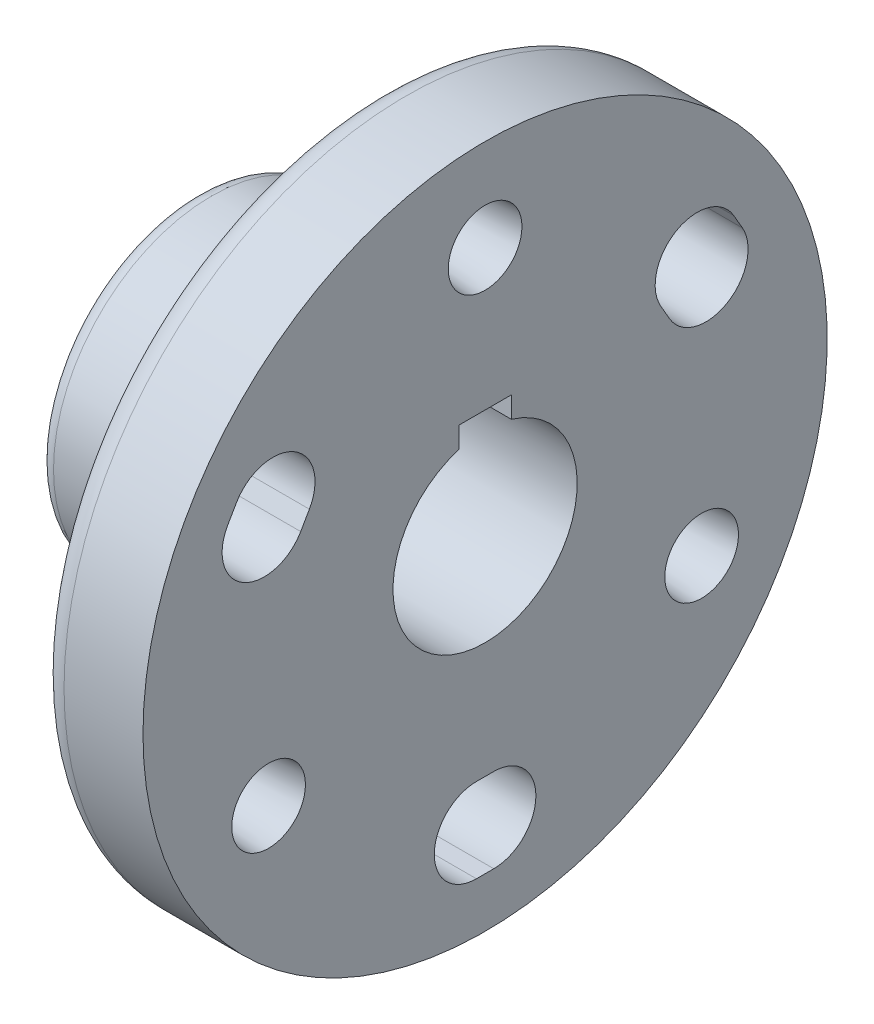
ISO-10303-21;
HEADER;
FILE_DESCRIPTION(('STEP AP214'),'2;1');
FILE_NAME('part.step','',(''),(''),'','','');
FILE_SCHEMA(('AUTOMOTIVE_DESIGN { 1 0 10303 214 1 1 1 1 }'));
ENDSEC;
DATA;
#1=APPLICATION_CONTEXT('core data for automotive mechanical design processes');
#2=APPLICATION_PROTOCOL_DEFINITION('international standard','automotive_design',2000,#1);
#3=PRODUCT_CONTEXT('',#1,'mechanical');
#4=PRODUCT('Part','Part','',(#3));
#5=PRODUCT_RELATED_PRODUCT_CATEGORY('part','',(#4));
#6=PRODUCT_DEFINITION_FORMATION('','',#4);
#7=PRODUCT_DEFINITION_CONTEXT('part definition',#1,'design');
#8=PRODUCT_DEFINITION('design','',#6,#7);
#9=PRODUCT_DEFINITION_SHAPE('','',#8);
#10=(LENGTH_UNIT() NAMED_UNIT(*) SI_UNIT(.MILLI.,.METRE.));
#11=(NAMED_UNIT(*) PLANE_ANGLE_UNIT() SI_UNIT($,.RADIAN.));
#12=(NAMED_UNIT(*) SI_UNIT($,.STERADIAN.) SOLID_ANGLE_UNIT());
#13=UNCERTAINTY_MEASURE_WITH_UNIT(LENGTH_MEASURE(1.E-05),#10,'distance_accuracy_value','');
#14=(GEOMETRIC_REPRESENTATION_CONTEXT(3) GLOBAL_UNCERTAINTY_ASSIGNED_CONTEXT((#13)) GLOBAL_UNIT_ASSIGNED_CONTEXT((#10,
#11,#12)) REPRESENTATION_CONTEXT('',''));
#15=CARTESIAN_POINT('',(0.,0.,0.));
#16=DIRECTION('',(0.,0.,1.));
#17=DIRECTION('',(1.,0.,0.));
#18=AXIS2_PLACEMENT_3D('',#15,#16,#17);
#19=CARTESIAN_POINT('',(0.,0.,0.));
#20=DIRECTION('',(-1.,0.,0.));
#21=DIRECTION('',(0.,0.,1.));
#22=AXIS2_PLACEMENT_3D('',#19,#20,#21);
#23=PLANE('',#22);
#24=CARTESIAN_POINT('',(0.,-23.7500000000018,41.1362066797578));
#25=DIRECTION('',(1.,0.,0.));
#26=DIRECTION('',(0.,0.,-1.));
#27=AXIS2_PLACEMENT_3D('',#24,#25,#26);
#28=CIRCLE('',#27,7.00000000000384);
#29=CARTESIAN_POINT('',(0.,-23.7500000000018,34.136206679754));
#30=VERTEX_POINT('',#29);
#31=EDGE_CURVE('E417',#30,#30,#28,.T.);
#32=ORIENTED_EDGE('',*,*,#31,.F.);
#33=EDGE_LOOP('',(#32));
#34=FACE_BOUND('',#33,.T.);
#35=CARTESIAN_POINT('',(0.,-23.7499999999982,-41.1362066797639));
#36=DIRECTION('',(1.,0.,0.));
#37=DIRECTION('',(0.,0.,-1.));
#38=AXIS2_PLACEMENT_3D('',#35,#36,#37);
#39=CIRCLE('',#38,7.00000000000261);
#40=CARTESIAN_POINT('',(0.,-23.7499999999982,-48.1362066797665));
#41=VERTEX_POINT('',#40);
#42=EDGE_CURVE('E422',#41,#41,#39,.T.);
#43=ORIENTED_EDGE('',*,*,#42,.F.);
#44=EDGE_LOOP('',(#43));
#45=FACE_BOUND('',#44,.T.);
#46=CARTESIAN_POINT('',(0.,47.5,0.));
#47=DIRECTION('',(1.,0.,0.));
#48=DIRECTION('',(0.,0.,-1.));
#49=AXIS2_PLACEMENT_3D('',#46,#47,#48);
#50=CIRCLE('',#49,7.);
#51=CARTESIAN_POINT('',(0.,47.5,-7.));
#52=VERTEX_POINT('',#51);
#53=EDGE_CURVE('E414',#52,#52,#50,.T.);
#54=ORIENTED_EDGE('',*,*,#53,.F.);
#55=EDGE_LOOP('',(#54));
#56=FACE_BOUND('',#55,.T.);
#57=DIRECTION('',(0.,0.866025403784443,0.499999999999992));
#58=VECTOR('',#57,1.);
#59=CARTESIAN_POINT('',(0.,27.7499999999996,-48.0644099100366));
#60=LINE('',#59,#58);
#61=CARTESIAN_POINT('',(0.,26.3210580837552,-48.8894099100366));
#62=VERTEX_POINT('',#61);
#63=CARTESIAN_POINT('',(0.,29.1789419162439,-47.2394099100366));
#64=VERTEX_POINT('',#63);
#65=EDGE_CURVE('E207',#62,#64,#60,.T.);
#66=ORIENTED_EDGE('',*,*,#65,.F.);
#67=CARTESIAN_POINT('',(0.,22.3210580837553,-41.961206679761));
#68=DIRECTION('',(1.,0.,0.));
#69=DIRECTION('',(0.,0.,-1.));
#70=AXIS2_PLACEMENT_3D('',#67,#68,#69);
#71=CIRCLE('',#70,8.);
#72=CARTESIAN_POINT('',(0.,18.3210580837553,-35.0330034494855));
#73=VERTEX_POINT('',#72);
#74=EDGE_CURVE('E89',#73,#62,#71,.T.);
#75=ORIENTED_EDGE('',*,*,#74,.F.);
#76=DIRECTION('',(0.,0.866025403784443,0.499999999999992));
#77=VECTOR('',#76,1.);
#78=CARTESIAN_POINT('',(0.,19.7499999999997,-34.2080034494855));
#79=LINE('',#78,#77);
#80=CARTESIAN_POINT('',(0.,21.178941916244,-33.3830034494855));
#81=VERTEX_POINT('',#80);
#82=EDGE_CURVE('E195',#73,#81,#79,.T.);
#83=ORIENTED_EDGE('',*,*,#82,.T.);
#84=CARTESIAN_POINT('',(0.,25.178941916244,-40.3112066797611));
#85=DIRECTION('',(1.,0.,0.));
#86=DIRECTION('',(0.,0.,-1.));
#87=AXIS2_PLACEMENT_3D('',#84,#85,#86);
#88=CIRCLE('',#87,8.);
#89=EDGE_CURVE('E201',#64,#81,#88,.T.);
#90=ORIENTED_EDGE('',*,*,#89,.F.);
#91=EDGE_LOOP('',(#66,#75,#83,#90));
#92=FACE_BOUND('',#91,.T.);
#93=DIRECTION('',(0.,0.,-1.));
#94=VECTOR('',#93,1.);
#95=CARTESIAN_POINT('',(0.,-55.5,0.));
#96=LINE('',#95,#94);
#97=CARTESIAN_POINT('',(0.,-55.5,1.65000000000001));
#98=VERTEX_POINT('',#97);
#99=CARTESIAN_POINT('',(0.,-55.5,-1.65000000000001));
#100=VERTEX_POINT('',#99);
#101=EDGE_CURVE('E231',#98,#100,#96,.T.);
#102=ORIENTED_EDGE('',*,*,#101,.F.);
#103=CARTESIAN_POINT('',(0.,-47.5,1.65000000000001));
#104=DIRECTION('',(1.,0.,0.));
#105=DIRECTION('',(0.,0.,-1.));
#106=AXIS2_PLACEMENT_3D('',#103,#104,#105);
#107=CIRCLE('',#106,8.);
#108=CARTESIAN_POINT('',(0.,-39.5,1.65000000000001));
#109=VERTEX_POINT('',#108);
#110=EDGE_CURVE('E97',#109,#98,#107,.T.);
#111=ORIENTED_EDGE('',*,*,#110,.F.);
#112=DIRECTION('',(0.,0.,-1.));
#113=VECTOR('',#112,1.);
#114=CARTESIAN_POINT('',(0.,-39.5,0.));
#115=LINE('',#114,#113);
#116=CARTESIAN_POINT('',(0.,-39.5,-1.65));
#117=VERTEX_POINT('',#116);
#118=EDGE_CURVE('E218',#109,#117,#115,.T.);
#119=ORIENTED_EDGE('',*,*,#118,.T.);
#120=CARTESIAN_POINT('',(0.,-47.5,-1.65000000000001));
#121=DIRECTION('',(1.,0.,0.));
#122=DIRECTION('',(0.,0.,-1.));
#123=AXIS2_PLACEMENT_3D('',#120,#121,#122);
#124=CIRCLE('',#123,8.);
#125=EDGE_CURVE('E228',#100,#117,#124,.T.);
#126=ORIENTED_EDGE('',*,*,#125,.F.);
#127=EDGE_LOOP('',(#102,#111,#119,#126));
#128=FACE_BOUND('',#127,.T.);
#129=CARTESIAN_POINT('',(0.,0.,0.));
#130=DIRECTION('',(-1.,0.,0.));
#131=DIRECTION('',(0.,0.,1.));
#132=AXIS2_PLACEMENT_3D('',#129,#130,#131);
#133=CIRCLE('',#132,65.);
#134=CARTESIAN_POINT('',(0.,0.,65.));
#135=VERTEX_POINT('',#134);
#136=EDGE_CURVE('E300',#135,#135,#133,.T.);
#137=ORIENTED_EDGE('',*,*,#136,.F.);
#138=EDGE_LOOP('',(#137));
#139=FACE_BOUND('',#138,.T.);
#140=DIRECTION('',(0.,0.,1.));
#141=VECTOR('',#140,1.);
#142=CARTESIAN_POINT('',(0.,20.8,5.));
#143=LINE('',#142,#141);
#144=CARTESIAN_POINT('',(0.,20.8,-5.));
#145=VERTEX_POINT('',#144);
#146=CARTESIAN_POINT('',(0.,20.8,5.));
#147=VERTEX_POINT('',#146);
#148=EDGE_CURVE('E268',#145,#147,#143,.T.);
#149=ORIENTED_EDGE('',*,*,#148,.F.);
#150=DIRECTION('',(0.,1.,0.));
#151=VECTOR('',#150,1.);
#152=CARTESIAN_POINT('',(0.,14.2,-5.));
#153=LINE('',#152,#151);
#154=CARTESIAN_POINT('',(0.,16.7705098312484,-5.));
#155=VERTEX_POINT('',#154);
#156=EDGE_CURVE('E255',#155,#145,#153,.T.);
#157=ORIENTED_EDGE('',*,*,#156,.F.);
#158=CARTESIAN_POINT('',(0.,0.,0.));
#159=DIRECTION('',(-1.,0.,0.));
#160=DIRECTION('',(0.,0.,1.));
#161=AXIS2_PLACEMENT_3D('',#158,#159,#160);
#162=CIRCLE('',#161,17.5);
#163=CARTESIAN_POINT('',(0.,16.7705098312484,5.));
#164=VERTEX_POINT('',#163);
#165=EDGE_CURVE('E277',#155,#164,#162,.T.);
#166=ORIENTED_EDGE('',*,*,#165,.T.);
#167=DIRECTION('',(0.,-1.,0.));
#168=VECTOR('',#167,1.);
#169=CARTESIAN_POINT('',(0.,14.2,5.));
#170=LINE('',#169,#168);
#171=EDGE_CURVE('E260',#147,#164,#170,.T.);
#172=ORIENTED_EDGE('',*,*,#171,.F.);
#173=EDGE_LOOP('',(#149,#157,#166,#172));
#174=FACE_BOUND('',#173,.T.);
#175=DIRECTION('',(0.,-0.866025403784436,0.500000000000004));
#176=VECTOR('',#175,1.);
#177=CARTESIAN_POINT('',(0.,19.7500000000002,34.2080034494853));
#178=LINE('',#177,#176);
#179=CARTESIAN_POINT('',(0.,21.1789419162445,33.3830034494853));
#180=VERTEX_POINT('',#179);
#181=CARTESIAN_POINT('',(0.,18.3210580837558,35.0330034494853));
#182=VERTEX_POINT('',#181);
#183=EDGE_CURVE('E237',#180,#182,#178,.T.);
#184=ORIENTED_EDGE('',*,*,#183,.T.);
#185=CARTESIAN_POINT('',(0.,22.3210580837559,41.9612066797608));
#186=DIRECTION('',(1.,0.,0.));
#187=DIRECTION('',(0.,0.,-1.));
#188=AXIS2_PLACEMENT_3D('',#185,#186,#187);
#189=CIRCLE('',#188,8.);
#190=CARTESIAN_POINT('',(0.,26.3210580837559,48.8894099100362));
#191=VERTEX_POINT('',#190);
#192=EDGE_CURVE('E211',#191,#182,#189,.T.);
#193=ORIENTED_EDGE('',*,*,#192,.F.);
#194=DIRECTION('',(0.,-0.866025403784436,0.500000000000004));
#195=VECTOR('',#194,1.);
#196=CARTESIAN_POINT('',(0.,27.7500000000003,48.0644099100362));
#197=LINE('',#196,#195);
#198=CARTESIAN_POINT('',(0.,29.1789419162446,47.2394099100362));
#199=VERTEX_POINT('',#198);
#200=EDGE_CURVE('E208',#199,#191,#197,.T.);
#201=ORIENTED_EDGE('',*,*,#200,.F.);
#202=CARTESIAN_POINT('',(0.,25.1789419162445,40.3112066797607));
#203=DIRECTION('',(1.,0.,0.));
#204=DIRECTION('',(0.,0.,-1.));
#205=AXIS2_PLACEMENT_3D('',#202,#203,#204);
#206=CIRCLE('',#205,8.);
#207=EDGE_CURVE('E240',#180,#199,#206,.T.);
#208=ORIENTED_EDGE('',*,*,#207,.F.);
#209=EDGE_LOOP('',(#184,#193,#201,#208));
#210=FACE_BOUND('',#209,.T.);
#211=ADVANCED_FACE('F72',(#34,#45,#56,#92,#128,#139,#174,#210),#23,.F.);
#212=CARTESIAN_POINT('',(-20.,60.,0.));
#213=DIRECTION('',(1.,0.,0.));
#214=DIRECTION('',(0.,0.,-1.));
#215=AXIS2_PLACEMENT_3D('',#212,#213,#214);
#216=PLANE('',#215);
#217=CARTESIAN_POINT('',(-20.,-23.7500000000018,41.1362066797578));
#218=DIRECTION('',(1.,0.,0.));
#219=DIRECTION('',(0.,0.,-1.));
#220=AXIS2_PLACEMENT_3D('',#217,#218,#219);
#221=CIRCLE('',#220,5.50005382290806);
#222=CARTESIAN_POINT('',(-20.,-23.7500000000018,35.6361528568497));
#223=VERTEX_POINT('',#222);
#224=EDGE_CURVE('E76',#223,#223,#221,.T.);
#225=ORIENTED_EDGE('',*,*,#224,.T.);
#226=EDGE_LOOP('',(#225));
#227=FACE_BOUND('',#226,.T.);
#228=CARTESIAN_POINT('',(-20.,-23.7499999999982,-41.1362066797639));
#229=DIRECTION('',(1.,0.,0.));
#230=DIRECTION('',(0.,0.,-1.));
#231=AXIS2_PLACEMENT_3D('',#228,#229,#230);
#232=CIRCLE('',#231,5.50005382290684);
#233=CARTESIAN_POINT('',(-20.,-23.7499999999982,-46.6362605026707));
#234=VERTEX_POINT('',#233);
#235=EDGE_CURVE('E415',#234,#234,#232,.T.);
#236=ORIENTED_EDGE('',*,*,#235,.T.);
#237=EDGE_LOOP('',(#236));
#238=FACE_BOUND('',#237,.T.);
#239=CARTESIAN_POINT('',(-20.,47.5,0.));
#240=DIRECTION('',(1.,0.,0.));
#241=DIRECTION('',(0.,0.,-1.));
#242=AXIS2_PLACEMENT_3D('',#239,#240,#241);
#243=CIRCLE('',#242,5.50005382290423);
#244=CARTESIAN_POINT('',(-20.,47.5,-5.50005382290423));
#245=VERTEX_POINT('',#244);
#246=EDGE_CURVE('E225',#245,#245,#243,.T.);
#247=ORIENTED_EDGE('',*,*,#246,.T.);
#248=EDGE_LOOP('',(#247));
#249=FACE_BOUND('',#248,.T.);
#250=DIRECTION('',(0.,0.866025403784443,0.499999999999992));
#251=VECTOR('',#250,1.);
#252=CARTESIAN_POINT('',(-20.,64.7500000000001,-8.22724133595264));
#253=LINE('',#252,#251);
#254=CARTESIAN_POINT('',(-20.,18.3210580837553,-35.0330034494855));
#255=VERTEX_POINT('',#254);
#256=CARTESIAN_POINT('',(-20.,21.178941916244,-33.3830034494855));
#257=VERTEX_POINT('',#256);
#258=EDGE_CURVE('E81',#255,#257,#253,.T.);
#259=ORIENTED_EDGE('',*,*,#258,.F.);
#260=CARTESIAN_POINT('',(-20.,22.3210580837553,-41.961206679761));
#261=DIRECTION('',(1.,0.,0.));
#262=DIRECTION('',(0.,0.,-1.));
#263=AXIS2_PLACEMENT_3D('',#260,#261,#262);
#264=CIRCLE('',#263,8.);
#265=CARTESIAN_POINT('',(-20.,26.3210580837552,-48.8894099100366));
#266=VERTEX_POINT('',#265);
#267=EDGE_CURVE('E14',#255,#266,#264,.T.);
#268=ORIENTED_EDGE('',*,*,#267,.T.);
#269=DIRECTION('',(0.,0.866025403784443,0.499999999999992));
#270=VECTOR('',#269,1.);
#271=CARTESIAN_POINT('',(-20.,72.75,-22.0836477965037));
#272=LINE('',#271,#270);
#273=CARTESIAN_POINT('',(-20.,29.1789419162439,-47.2394099100366));
#274=VERTEX_POINT('',#273);
#275=EDGE_CURVE('E406',#266,#274,#272,.T.);
#276=ORIENTED_EDGE('',*,*,#275,.T.);
#277=CARTESIAN_POINT('',(-20.,25.178941916244,-40.3112066797611));
#278=DIRECTION('',(1.,0.,0.));
#279=DIRECTION('',(0.,0.,-1.));
#280=AXIS2_PLACEMENT_3D('',#277,#278,#279);
#281=CIRCLE('',#280,8.);
#282=EDGE_CURVE('E409',#274,#257,#281,.T.);
#283=ORIENTED_EDGE('',*,*,#282,.T.);
#284=EDGE_LOOP('',(#259,#268,#276,#283));
#285=FACE_BOUND('',#284,.T.);
#286=DIRECTION('',(0.,0.,-1.));
#287=VECTOR('',#286,1.);
#288=CARTESIAN_POINT('',(-20.,-39.5,0.));
#289=LINE('',#288,#287);
#290=CARTESIAN_POINT('',(-20.,-39.5,1.65000000000001));
#291=VERTEX_POINT('',#290);
#292=CARTESIAN_POINT('',(-20.,-39.5,-1.65));
#293=VERTEX_POINT('',#292);
#294=EDGE_CURVE('E401',#291,#293,#289,.T.);
#295=ORIENTED_EDGE('',*,*,#294,.F.);
#296=CARTESIAN_POINT('',(-20.,-47.5,1.65000000000001));
#297=DIRECTION('',(1.,0.,0.));
#298=DIRECTION('',(0.,0.,-1.));
#299=AXIS2_PLACEMENT_3D('',#296,#297,#298);
#300=CIRCLE('',#299,8.);
#301=CARTESIAN_POINT('',(-20.,-55.5,1.65000000000001));
#302=VERTEX_POINT('',#301);
#303=EDGE_CURVE('E403',#291,#302,#300,.T.);
#304=ORIENTED_EDGE('',*,*,#303,.T.);
#305=DIRECTION('',(0.,0.,-1.));
#306=VECTOR('',#305,1.);
#307=CARTESIAN_POINT('',(-20.,-55.5,0.));
#308=LINE('',#307,#306);
#309=CARTESIAN_POINT('',(-20.,-55.5,-1.65000000000001));
#310=VERTEX_POINT('',#309);
#311=EDGE_CURVE('E391',#302,#310,#308,.T.);
#312=ORIENTED_EDGE('',*,*,#311,.T.);
#313=CARTESIAN_POINT('',(-20.,-47.5,-1.65000000000001));
#314=DIRECTION('',(1.,0.,0.));
#315=DIRECTION('',(0.,0.,-1.));
#316=AXIS2_PLACEMENT_3D('',#313,#314,#315);
#317=CIRCLE('',#316,8.);
#318=EDGE_CURVE('E394',#310,#293,#317,.T.);
#319=ORIENTED_EDGE('',*,*,#318,.T.);
#320=EDGE_LOOP('',(#295,#304,#312,#319));
#321=FACE_BOUND('',#320,.T.);
#322=CARTESIAN_POINT('',(-20.,0.,0.));
#323=DIRECTION('',(-1.,0.,0.));
#324=DIRECTION('',(0.,0.,1.));
#325=AXIS2_PLACEMENT_3D('',#322,#323,#324);
#326=CIRCLE('',#325,60.);
#327=CARTESIAN_POINT('',(-20.,0.,60.));
#328=VERTEX_POINT('',#327);
#329=EDGE_CURVE('E294',#328,#328,#326,.T.);
#330=ORIENTED_EDGE('',*,*,#329,.T.);
#331=EDGE_LOOP('',(#330));
#332=FACE_BOUND('',#331,.T.);
#333=CARTESIAN_POINT('',(-20.,0.,0.));
#334=DIRECTION('',(-1.,0.,0.));
#335=DIRECTION('',(0.,0.,1.));
#336=AXIS2_PLACEMENT_3D('',#333,#334,#335);
#337=CIRCLE('',#336,38.);
#338=CARTESIAN_POINT('',(-20.,0.,38.));
#339=VERTEX_POINT('',#338);
#340=EDGE_CURVE('E291',#339,#339,#337,.T.);
#341=ORIENTED_EDGE('',*,*,#340,.F.);
#342=EDGE_LOOP('',(#341));
#343=FACE_BOUND('',#342,.T.);
#344=DIRECTION('',(0.,-0.866025403784436,0.500000000000004));
#345=VECTOR('',#344,1.);
#346=CARTESIAN_POINT('',(-20.,64.7499999999999,8.22724133595196));
#347=LINE('',#346,#345);
#348=CARTESIAN_POINT('',(-20.,21.1789419162445,33.3830034494853));
#349=VERTEX_POINT('',#348);
#350=CARTESIAN_POINT('',(-20.,18.3210580837558,35.0330034494853));
#351=VERTEX_POINT('',#350);
#352=EDGE_CURVE('E385',#349,#351,#347,.T.);
#353=ORIENTED_EDGE('',*,*,#352,.F.);
#354=CARTESIAN_POINT('',(-20.,25.1789419162445,40.3112066797607));
#355=DIRECTION('',(1.,0.,0.));
#356=DIRECTION('',(0.,0.,-1.));
#357=AXIS2_PLACEMENT_3D('',#354,#355,#356);
#358=CIRCLE('',#357,8.);
#359=CARTESIAN_POINT('',(-20.,29.1789419162446,47.2394099100362));
#360=VERTEX_POINT('',#359);
#361=EDGE_CURVE('E316',#349,#360,#358,.T.);
#362=ORIENTED_EDGE('',*,*,#361,.T.);
#363=DIRECTION('',(0.,-0.866025403784436,0.500000000000004));
#364=VECTOR('',#363,1.);
#365=CARTESIAN_POINT('',(-20.,72.75,22.0836477965029));
#366=LINE('',#365,#364);
#367=CARTESIAN_POINT('',(-20.,26.3210580837559,48.8894099100362));
#368=VERTEX_POINT('',#367);
#369=EDGE_CURVE('E396',#360,#368,#366,.T.);
#370=ORIENTED_EDGE('',*,*,#369,.T.);
#371=CARTESIAN_POINT('',(-20.,22.3210580837559,41.9612066797608));
#372=DIRECTION('',(1.,0.,0.));
#373=DIRECTION('',(0.,0.,-1.));
#374=AXIS2_PLACEMENT_3D('',#371,#372,#373);
#375=CIRCLE('',#374,8.);
#376=EDGE_CURVE('E387',#368,#351,#375,.T.);
#377=ORIENTED_EDGE('',*,*,#376,.T.);
#378=EDGE_LOOP('',(#353,#362,#370,#377));
#379=FACE_BOUND('',#378,.T.);
#380=ADVANCED_FACE('F356',(#227,#238,#249,#285,#321,#332,#343,#379),#216,.F.);
#381=CARTESIAN_POINT('',(-55.,27.,0.));
#382=DIRECTION('',(1.,0.,0.));
#383=DIRECTION('',(0.,0.,-1.));
#384=AXIS2_PLACEMENT_3D('',#381,#382,#383);
#385=PLANE('',#384);
#386=CARTESIAN_POINT('',(-55.,0.,0.));
#387=DIRECTION('',(-1.,0.,0.));
#388=DIRECTION('',(0.,0.,1.));
#389=AXIS2_PLACEMENT_3D('',#386,#387,#388);
#390=CIRCLE('',#389,17.5);
#391=CARTESIAN_POINT('',(-55.,16.7705098312484,-5.));
#392=VERTEX_POINT('',#391);
#393=CARTESIAN_POINT('',(-55.,16.7705098312484,5.));
#394=VERTEX_POINT('',#393);
#395=EDGE_CURVE('E274',#392,#394,#390,.T.);
#396=ORIENTED_EDGE('',*,*,#395,.F.);
#397=DIRECTION('',(0.,1.,0.));
#398=VECTOR('',#397,1.);
#399=CARTESIAN_POINT('',(-55.,14.2,-5.));
#400=LINE('',#399,#398);
#401=CARTESIAN_POINT('',(-55.,20.8,-5.));
#402=VERTEX_POINT('',#401);
#403=EDGE_CURVE('E256',#392,#402,#400,.T.);
#404=ORIENTED_EDGE('',*,*,#403,.T.);
#405=DIRECTION('',(0.,0.,1.));
#406=VECTOR('',#405,1.);
#407=CARTESIAN_POINT('',(-55.,20.8,5.));
#408=LINE('',#407,#406);
#409=CARTESIAN_POINT('',(-55.,20.8,5.));
#410=VERTEX_POINT('',#409);
#411=EDGE_CURVE('E259',#402,#410,#408,.T.);
#412=ORIENTED_EDGE('',*,*,#411,.T.);
#413=DIRECTION('',(0.,-1.,0.));
#414=VECTOR('',#413,1.);
#415=CARTESIAN_POINT('',(-55.,14.2,5.));
#416=LINE('',#415,#414);
#417=EDGE_CURVE('E263',#410,#394,#416,.T.);
#418=ORIENTED_EDGE('',*,*,#417,.T.);
#419=EDGE_LOOP('',(#396,#404,#412,#418));
#420=FACE_BOUND('',#419,.T.);
#421=CARTESIAN_POINT('',(-55.,0.,0.));
#422=DIRECTION('',(-1.,0.,0.));
#423=DIRECTION('',(0.,0.,1.));
#424=AXIS2_PLACEMENT_3D('',#421,#422,#423);
#425=CIRCLE('',#424,27.);
#426=CARTESIAN_POINT('',(-55.,0.,27.));
#427=VERTEX_POINT('',#426);
#428=EDGE_CURVE('E280',#427,#427,#425,.T.);
#429=ORIENTED_EDGE('',*,*,#428,.T.);
#430=EDGE_LOOP('',(#429));
#431=FACE_BOUND('',#430,.T.);
#432=ADVANCED_FACE('F74',(#420,#431),#385,.F.);
#433=CARTESIAN_POINT('',(-55.,0.,0.));
#434=DIRECTION('',(-1.,0.,0.));
#435=DIRECTION('',(0.,0.,1.));
#436=AXIS2_PLACEMENT_3D('',#433,#434,#435);
#437=CYLINDRICAL_SURFACE('',#436,65.);
#438=CARTESIAN_POINT('',(-15.,0.,0.));
#439=DIRECTION('',(-1.,0.,0.));
#440=DIRECTION('',(0.,0.,1.));
#441=AXIS2_PLACEMENT_3D('',#438,#439,#440);
#442=CIRCLE('',#441,65.);
#443=CARTESIAN_POINT('',(-15.,0.,65.));
#444=VERTEX_POINT('',#443);
#445=EDGE_CURVE('E297',#444,#444,#442,.T.);
#446=ORIENTED_EDGE('',*,*,#445,.F.);
#447=EDGE_LOOP('',(#446));
#448=FACE_BOUND('',#447,.T.);
#449=ORIENTED_EDGE('',*,*,#136,.T.);
#450=EDGE_LOOP('',(#449));
#451=FACE_BOUND('',#450,.T.);
#452=ADVANCED_FACE('F366',(#448,#451),#437,.T.);
#453=CARTESIAN_POINT('',(-15.,0.,0.));
#454=DIRECTION('',(-1.,0.,0.));
#455=DIRECTION('',(0.,0.,1.));
#456=AXIS2_PLACEMENT_3D('',#453,#454,#455);
#457=TOROIDAL_SURFACE('',#456,60.,5.);
#458=ORIENTED_EDGE('',*,*,#329,.F.);
#459=EDGE_LOOP('',(#458));
#460=FACE_BOUND('',#459,.T.);
#461=ORIENTED_EDGE('',*,*,#445,.T.);
#462=EDGE_LOOP('',(#461));
#463=FACE_BOUND('',#462,.T.);
#464=ADVANCED_FACE('F369',(#460,#463),#457,.T.);
#465=CARTESIAN_POINT('',(-28.,0.,0.));
#466=DIRECTION('',(-1.,0.,0.));
#467=DIRECTION('',(0.,0.,1.));
#468=AXIS2_PLACEMENT_3D('',#465,#466,#467);
#469=TOROIDAL_SURFACE('',#468,38.,8.);
#470=CARTESIAN_POINT('',(-28.,0.,0.));
#471=DIRECTION('',(-1.,0.,0.));
#472=DIRECTION('',(0.,0.,1.));
#473=AXIS2_PLACEMENT_3D('',#470,#471,#472);
#474=CIRCLE('',#473,30.);
#475=CARTESIAN_POINT('',(-28.,0.,30.));
#476=VERTEX_POINT('',#475);
#477=EDGE_CURVE('E288',#476,#476,#474,.T.);
#478=ORIENTED_EDGE('',*,*,#477,.F.);
#479=EDGE_LOOP('',(#478));
#480=FACE_BOUND('',#479,.T.);
#481=ORIENTED_EDGE('',*,*,#340,.T.);
#482=EDGE_LOOP('',(#481));
#483=FACE_BOUND('',#482,.T.);
#484=ADVANCED_FACE('F351',(#480,#483),#469,.F.);
#485=CARTESIAN_POINT('',(-55.,0.,0.));
#486=DIRECTION('',(-1.,0.,0.));
#487=DIRECTION('',(0.,0.,1.));
#488=AXIS2_PLACEMENT_3D('',#485,#486,#487);
#489=CYLINDRICAL_SURFACE('',#488,30.);
#490=CARTESIAN_POINT('',(-40.2297724794524,-29.732137494637,-4.00000000000001));
#491=CARTESIAN_POINT('',(-40.4533801903887,-29.7321408902408,-3.99999057189578));
#492=CARTESIAN_POINT('',(-40.6771245456852,-29.7346872928155,-3.98118653408272));
#493=CARTESIAN_POINT('',(-41.1183774041239,-29.7445929719378,-3.90647592532245));
#494=CARTESIAN_POINT('',(-41.3358792892868,-29.7519571726567,-3.85053139298222));
#495=CARTESIAN_POINT('',(-41.7581952159052,-29.7706498429081,-3.70322622280533));
#496=CARTESIAN_POINT('',(-41.9630181026879,-29.7819755112418,-3.61189060550091));
#497=CARTESIAN_POINT('',(-42.3543946308716,-29.8073116450363,-3.39645129761372));
#498=CARTESIAN_POINT('',(-42.5409511973285,-29.8213216795734,-3.27235286526938));
#499=CARTESIAN_POINT('',(-42.8917193887894,-29.8505475464148,-2.99406740979036));
#500=CARTESIAN_POINT('',(-43.0557982108112,-29.8657697698747,-2.83971364549719));
#501=CARTESIAN_POINT('',(-43.3558049703652,-29.8956475251647,-2.50565845745221));
#502=CARTESIAN_POINT('',(-43.4917314624048,-29.9103030278649,-2.32595573294397));
#503=CARTESIAN_POINT('',(-43.7320561628853,-29.9374619952073,-1.94546344985523));
#504=CARTESIAN_POINT('',(-43.8363334580329,-29.9499571300455,-1.74459687542245));
#505=CARTESIAN_POINT('',(-44.0096248078141,-29.9713170683162,-1.32800763207473));
#506=CARTESIAN_POINT('',(-44.0786403442078,-29.9801820242919,-1.1122855878448));
#507=CARTESIAN_POINT('',(-44.179050298613,-29.9932377239122,-0.673470750028178));
#508=CARTESIAN_POINT('',(-44.2106661094764,-29.9974559641015,-0.450429446939794));
#509=CARTESIAN_POINT('',(-44.2360656969261,-30.0008369594303,-0.00217000460731181));
#510=CARTESIAN_POINT('',(-44.2298511549255,-29.9999999392566,0.223048037444933));
#511=CARTESIAN_POINT('',(-44.1799430183706,-29.9933868823381,0.66776024893154));
#512=CARTESIAN_POINT('',(-44.1364875499612,-29.9876422267562,0.887281674723571));
#513=CARTESIAN_POINT('',(-44.0137038254094,-29.9718944818458,1.31588824542511));
#514=CARTESIAN_POINT('',(-43.9343748091162,-29.9618913022807,1.52497316908368));
#515=CARTESIAN_POINT('',(-43.7418455972088,-29.9386963800833,1.92750361684826));
#516=CARTESIAN_POINT('',(-43.6285432330863,-29.9254950429176,2.12089969870652));
#517=CARTESIAN_POINT('',(-43.3713579648867,-29.8973790083808,2.48602338146957));
#518=CARTESIAN_POINT('',(-43.2274734661968,-29.8824642216858,2.65774985173364));
#519=CARTESIAN_POINT('',(-42.9118767827346,-29.8524517619132,2.97606012309078));
#520=CARTESIAN_POINT('',(-42.7399569430652,-29.837353568488,3.12243806706043));
#521=CARTESIAN_POINT('',(-42.3738806167073,-29.8087899753847,3.38429386114383));
#522=CARTESIAN_POINT('',(-42.1797240418465,-29.7953245821815,3.49977158872707));
#523=CARTESIAN_POINT('',(-41.7744924787591,-29.7715515266868,3.69656572173001));
#524=CARTESIAN_POINT('',(-41.5634086704155,-29.7612455242957,3.77786417813414));
#525=CARTESIAN_POINT('',(-41.1304164381757,-29.7449895093144,3.90380180089849));
#526=CARTESIAN_POINT('',(-40.9085086113993,-29.7390392567232,3.94844298708287));
#527=CARTESIAN_POINT('',(-40.4619898094425,-29.7322129002069,3.99952321537455));
#528=CARTESIAN_POINT('',(-40.2374126187874,-29.7312982302326,4.00625262197625));
#529=CARTESIAN_POINT('',(-39.790333967243,-29.734544485934,3.98208576377592));
#530=CARTESIAN_POINT('',(-39.5678324559735,-29.738705288095,3.95119041459553));
#531=CARTESIAN_POINT('',(-39.1321005066412,-29.7515984087354,3.8528961007404));
#532=CARTESIAN_POINT('',(-38.9188374934162,-29.760312955753,3.7856390064672));
#533=CARTESIAN_POINT('',(-38.5066146525476,-29.7813171802881,3.61667690160251));
#534=CARTESIAN_POINT('',(-38.307655392805,-29.7936069996568,3.51497052418766));
#535=CARTESIAN_POINT('',(-37.9283778585708,-29.8204689323904,3.27928812834422));
#536=CARTESIAN_POINT('',(-37.748178382716,-29.8350542757827,3.14512246332601));
#537=CARTESIAN_POINT('',(-37.4127506025783,-29.8648228703302,2.84859664625598));
#538=CARTESIAN_POINT('',(-37.2575234071564,-29.8800061479987,2.68623524287508));
#539=CARTESIAN_POINT('',(-36.9754193716102,-29.9093789731066,2.33665509671648));
#540=CARTESIAN_POINT('',(-36.8487338467092,-29.9235614009943,2.14928128186505));
#541=CARTESIAN_POINT('',(-36.6286359151018,-29.9492268295661,1.75574490463524));
#542=CARTESIAN_POINT('',(-36.5352227599402,-29.9607098909698,1.5495827650274));
#543=CARTESIAN_POINT('',(-36.3846339562762,-29.9796512938231,1.12494554504687));
#544=CARTESIAN_POINT('',(-36.3273496212853,-29.9871216964156,0.906509568494723));
#545=CARTESIAN_POINT('',(-36.2502915085305,-29.9972463337324,0.463012986846395));
#546=CARTESIAN_POINT('',(-36.230515794037,-29.9999008171227,0.237952724399643));
#547=CARTESIAN_POINT('',(-36.2290759449718,-30.0000929449682,-0.210539747423174));
#548=CARTESIAN_POINT('',(-36.2471175382636,-29.9976700982679,-0.433971051843747));
#549=CARTESIAN_POINT('',(-36.3201745619164,-29.9880586643979,-0.874594886104723));
#550=CARTESIAN_POINT('',(-36.3751899404952,-29.9808700839026,-1.09178742468215));
#551=CARTESIAN_POINT('',(-36.5205365736057,-29.9625311328469,-1.51371646917767));
#552=CARTESIAN_POINT('',(-36.6108517322681,-29.9513825681572,-1.71845860308763));
#553=CARTESIAN_POINT('',(-36.8242035787443,-29.9263549879288,-2.10992815726196));
#554=CARTESIAN_POINT('',(-36.9472408707589,-29.9124759219737,-2.29665524479908));
#555=CARTESIAN_POINT('',(-37.2236258434581,-29.8834058241629,-2.64829457213272));
#556=CARTESIAN_POINT('',(-37.3771920597249,-29.8682058058701,-2.81303431432518));
#557=CARTESIAN_POINT('',(-37.7098186175531,-29.8382772980635,-3.11451791174715));
#558=CARTESIAN_POINT('',(-37.8888849673172,-29.8235489206796,-3.25125515061516));
#559=CARTESIAN_POINT('',(-38.2683403625753,-29.7961621972205,-3.49337581956155));
#560=CARTESIAN_POINT('',(-38.4688196623964,-29.7835132334187,-3.59861880854683));
#561=CARTESIAN_POINT('',(-38.88466941441,-29.7618273299481,-3.77379036559425));
#562=CARTESIAN_POINT('',(-39.1000236189516,-29.7527865201032,-3.84375679331906));
#563=CARTESIAN_POINT('',(-39.4686690369136,-29.7415026767313,-3.92990960757651));
#564=CARTESIAN_POINT('',(-39.6196490253914,-29.7380085724299,-3.95615496271737));
#565=CARTESIAN_POINT('',(-39.9236554983907,-29.7333248295038,-3.99120330686232));
#566=CARTESIAN_POINT('',(-40.0766819642464,-29.7321351698749,-4.00000645484598));
#567=CARTESIAN_POINT('',(-40.2297724794524,-29.732137494637,-4.00000000000001));
#568=B_SPLINE_CURVE_WITH_KNOTS('',3,(#490,#491,#492,#493,#494,#495,#496,#497,#498,#499,#500,
#501,#502,#503,#504,#505,#506,#507,#508,#509,#510,#511,#512,#513,#514,#515,#516,#517,#518,#519,
#520,#521,#522,#523,#524,#525,#526,#527,#528,#529,#530,#531,#532,#533,#534,#535,#536,#537,#538,
#539,#540,#541,#542,#543,#544,#545,#546,#547,#548,#549,#550,#551,#552,#553,#554,#555,#556,#557,
#558,#559,#560,#561,#562,#563,#564,#565,#566,#567),.UNSPECIFIED.,.T.,.F.,(4,2,2,2,2,2,2,2,2,2,2,
2,2,2,2,2,2,2,2,2,2,2,2,2,2,2,2,2,2,2,2,2,2,2,2,2,2,2,4),(0.,0.670263778500898,1.34121369221137,
2.0116901255365,2.68205901669913,3.35623190242331,4.03043939524477,4.70719113050294,
5.38391442513856,6.05661139049938,6.72927845729714,7.39767617339906,8.06608805333359,
8.73653056912504,9.40700805169258,10.0826983013792,10.7583912303818,11.4344385531148,
12.110448622982,12.7812740516386,13.4520831556709,14.1202936963719,14.7885307523642,
15.4607705628467,16.1330402150124,16.8096902352901,17.4863250335031,18.1609144754067,
18.835469084443,19.504794197126,20.1741183724129,20.8431377070039,21.5121693956216,
22.1861748473789,22.8603393681881,23.5374668396544,24.2138660462919,24.6727588189122,
25.1316474088673),.UNSPECIFIED.);
#569=CARTESIAN_POINT('',(-40.2297724794524,-29.732137494637,-4.00000000000001));
#570=VERTEX_POINT('',#569);
#571=EDGE_CURVE('E309',#570,#570,#568,.T.);
#572=ORIENTED_EDGE('',*,*,#571,.T.);
#573=EDGE_LOOP('',(#572));
#574=FACE_BOUND('',#573,.T.);
#575=CARTESIAN_POINT('',(-52.,0.,0.));
#576=DIRECTION('',(-1.,0.,0.));
#577=DIRECTION('',(0.,0.,1.));
#578=AXIS2_PLACEMENT_3D('',#575,#576,#577);
#579=CIRCLE('',#578,30.);
#580=CARTESIAN_POINT('',(-52.,0.,30.));
#581=VERTEX_POINT('',#580);
#582=EDGE_CURVE('E285',#581,#581,#579,.T.);
#583=ORIENTED_EDGE('',*,*,#582,.F.);
#584=EDGE_LOOP('',(#583));
#585=FACE_BOUND('',#584,.T.);
#586=ORIENTED_EDGE('',*,*,#477,.T.);
#587=EDGE_LOOP('',(#586));
#588=FACE_BOUND('',#587,.T.);
#589=ADVANCED_FACE('F318',(#574,#585,#588),#489,.T.);
#590=CARTESIAN_POINT('',(-52.,0.,0.));
#591=DIRECTION('',(-1.,0.,0.));
#592=DIRECTION('',(0.,0.,1.));
#593=AXIS2_PLACEMENT_3D('',#590,#591,#592);
#594=TOROIDAL_SURFACE('',#593,27.,3.);
#595=ORIENTED_EDGE('',*,*,#428,.F.);
#596=EDGE_LOOP('',(#595));
#597=FACE_BOUND('',#596,.T.);
#598=ORIENTED_EDGE('',*,*,#582,.T.);
#599=EDGE_LOOP('',(#598));
#600=FACE_BOUND('',#599,.T.);
#601=ADVANCED_FACE('F344',(#597,#600),#594,.T.);
#602=CARTESIAN_POINT('',(0.,0.,0.));
#603=DIRECTION('',(-1.,0.,0.));
#604=DIRECTION('',(0.,0.,1.));
#605=AXIS2_PLACEMENT_3D('',#602,#603,#604);
#606=CYLINDRICAL_SURFACE('',#605,17.5);
#607=ORIENTED_EDGE('',*,*,#165,.F.);
#608=DIRECTION('',(-1.,0.,0.));
#609=VECTOR('',#608,1.);
#610=CARTESIAN_POINT('',(0.,16.7705098312484,-5.));
#611=LINE('',#610,#609);
#612=EDGE_CURVE('E306',#155,#392,#611,.T.);
#613=ORIENTED_EDGE('',*,*,#612,.T.);
#614=ORIENTED_EDGE('',*,*,#395,.T.);
#615=DIRECTION('',(-1.,0.,0.));
#616=VECTOR('',#615,1.);
#617=CARTESIAN_POINT('',(0.,16.7705098312484,5.));
#618=LINE('',#617,#616);
#619=EDGE_CURVE('E303',#394,#164,#618,.F.);
#620=ORIENTED_EDGE('',*,*,#619,.T.);
#621=EDGE_LOOP('',(#607,#613,#614,#620));
#622=FACE_BOUND('',#621,.T.);
#623=ADVANCED_FACE('F341',(#622),#606,.F.);
#624=CARTESIAN_POINT('',(-55.,14.2,-5.));
#625=DIRECTION('',(0.,0.,-1.));
#626=DIRECTION('',(-1.,0.,0.));
#627=AXIS2_PLACEMENT_3D('',#624,#625,#626);
#628=PLANE('',#627);
#629=ORIENTED_EDGE('',*,*,#156,.T.);
#630=DIRECTION('',(1.,0.,0.));
#631=VECTOR('',#630,1.);
#632=CARTESIAN_POINT('',(-55.,20.8,-5.));
#633=LINE('',#632,#631);
#634=EDGE_CURVE('E266',#402,#145,#633,.T.);
#635=ORIENTED_EDGE('',*,*,#634,.F.);
#636=ORIENTED_EDGE('',*,*,#403,.F.);
#637=ORIENTED_EDGE('',*,*,#612,.F.);
#638=EDGE_LOOP('',(#629,#635,#636,#637));
#639=FACE_BOUND('',#638,.T.);
#640=ADVANCED_FACE('F334',(#639),#628,.F.);
#641=CARTESIAN_POINT('',(-55.,14.2,5.));
#642=DIRECTION('',(0.,0.,1.));
#643=DIRECTION('',(1.,0.,0.));
#644=AXIS2_PLACEMENT_3D('',#641,#642,#643);
#645=PLANE('',#644);
#646=ORIENTED_EDGE('',*,*,#417,.F.);
#647=DIRECTION('',(1.,0.,0.));
#648=VECTOR('',#647,1.);
#649=CARTESIAN_POINT('',(-55.,20.8,5.));
#650=LINE('',#649,#648);
#651=EDGE_CURVE('E272',#410,#147,#650,.T.);
#652=ORIENTED_EDGE('',*,*,#651,.T.);
#653=ORIENTED_EDGE('',*,*,#171,.T.);
#654=ORIENTED_EDGE('',*,*,#619,.F.);
#655=EDGE_LOOP('',(#646,#652,#653,#654));
#656=FACE_BOUND('',#655,.T.);
#657=ADVANCED_FACE('F331',(#656),#645,.F.);
#658=CARTESIAN_POINT('',(-55.,20.8,5.));
#659=DIRECTION('',(0.,1.,0.));
#660=DIRECTION('',(0.,0.,1.));
#661=AXIS2_PLACEMENT_3D('',#658,#659,#660);
#662=PLANE('',#661);
#663=ORIENTED_EDGE('',*,*,#148,.T.);
#664=ORIENTED_EDGE('',*,*,#651,.F.);
#665=ORIENTED_EDGE('',*,*,#411,.F.);
#666=ORIENTED_EDGE('',*,*,#634,.T.);
#667=EDGE_LOOP('',(#663,#664,#665,#666));
#668=FACE_BOUND('',#667,.T.);
#669=ADVANCED_FACE('F328',(#668),#662,.F.);
#670=CARTESIAN_POINT('',(-40.2297724794524,-20.,0.));
#671=DIRECTION('',(0.,-1.,0.));
#672=DIRECTION('',(0.,0.,-1.));
#673=AXIS2_PLACEMENT_3D('',#670,#671,#672);
#674=CYLINDRICAL_SURFACE('',#673,4.00000000000001);
#675=CARTESIAN_POINT('',(-40.2297724794524,-20.,0.));
#676=DIRECTION('',(0.,-1.,0.));
#677=DIRECTION('',(0.,0.,-1.));
#678=AXIS2_PLACEMENT_3D('',#675,#676,#677);
#679=CIRCLE('',#678,4.00000000000001);
#680=CARTESIAN_POINT('',(-40.2297724794524,-20.,-4.00000000000001));
#681=VERTEX_POINT('',#680);
#682=EDGE_CURVE('E246',#681,#681,#679,.T.);
#683=ORIENTED_EDGE('',*,*,#682,.F.);
#684=EDGE_LOOP('',(#683));
#685=FACE_BOUND('',#684,.T.);
#686=ORIENTED_EDGE('',*,*,#571,.F.);
#687=EDGE_LOOP('',(#686));
#688=FACE_BOUND('',#687,.T.);
#689=ADVANCED_FACE('F322',(#685,#688),#674,.F.);
#690=CARTESIAN_POINT('',(-40.2297724794524,-20.,0.));
#691=DIRECTION('',(0.,-1.,0.));
#692=DIRECTION('',(0.,0.,-1.));
#693=AXIS2_PLACEMENT_3D('',#690,#691,#692);
#694=PLANE('',#693);
#695=ORIENTED_EDGE('',*,*,#682,.T.);
#696=EDGE_LOOP('',(#695));
#697=FACE_BOUND('',#696,.T.);
#698=ADVANCED_FACE('F327',(#697),#694,.T.);
#699=CARTESIAN_POINT('',(-55.,19.7500000000002,34.2080034494853));
#700=DIRECTION('',(0.,0.500000000000004,0.866025403784436));
#701=DIRECTION('',(0.,-0.866025403784436,0.500000000000004));
#702=AXIS2_PLACEMENT_3D('',#699,#700,#701);
#703=PLANE('',#702);
#704=ORIENTED_EDGE('',*,*,#352,.T.);
#705=DIRECTION('',(1.,0.,0.));
#706=VECTOR('',#705,1.);
#707=CARTESIAN_POINT('',(-55.,18.3210580837558,35.0330034494853));
#708=LINE('',#707,#706);
#709=EDGE_CURVE('E250',#351,#182,#708,.T.);
#710=ORIENTED_EDGE('',*,*,#709,.T.);
#711=ORIENTED_EDGE('',*,*,#183,.F.);
#712=DIRECTION('',(1.,0.,0.));
#713=VECTOR('',#712,1.);
#714=CARTESIAN_POINT('',(-55.,21.1789419162445,33.3830034494853));
#715=LINE('',#714,#713);
#716=EDGE_CURVE('E247',#349,#180,#715,.T.);
#717=ORIENTED_EDGE('',*,*,#716,.F.);
#718=EDGE_LOOP('',(#704,#710,#711,#717));
#719=FACE_BOUND('',#718,.T.);
#720=ADVANCED_FACE('F456',(#719),#703,.T.);
#721=CARTESIAN_POINT('',(-55.,22.3210580837559,41.9612066797608));
#722=DIRECTION('',(1.,0.,0.));
#723=DIRECTION('',(0.,0.,-1.));
#724=AXIS2_PLACEMENT_3D('',#721,#722,#723);
#725=CYLINDRICAL_SURFACE('',#724,8.);
#726=DIRECTION('',(1.,0.,0.));
#727=VECTOR('',#726,1.);
#728=CARTESIAN_POINT('',(-55.,26.3210580837559,48.8894099100362));
#729=LINE('',#728,#727);
#730=EDGE_CURVE('E243',#368,#191,#729,.T.);
#731=ORIENTED_EDGE('',*,*,#730,.T.);
#732=ORIENTED_EDGE('',*,*,#192,.T.);
#733=ORIENTED_EDGE('',*,*,#709,.F.);
#734=ORIENTED_EDGE('',*,*,#376,.F.);
#735=EDGE_LOOP('',(#731,#732,#733,#734));
#736=FACE_BOUND('',#735,.T.);
#737=ADVANCED_FACE('F464',(#736),#725,.F.);
#738=CARTESIAN_POINT('',(-55.,27.7500000000003,48.0644099100362));
#739=DIRECTION('',(0.,0.500000000000004,0.866025403784436));
#740=DIRECTION('',(0.,-0.866025403784436,0.500000000000004));
#741=AXIS2_PLACEMENT_3D('',#738,#739,#740);
#742=PLANE('',#741);
#743=DIRECTION('',(1.,0.,0.));
#744=VECTOR('',#743,1.);
#745=CARTESIAN_POINT('',(-55.,29.1789419162446,47.2394099100362));
#746=LINE('',#745,#744);
#747=EDGE_CURVE('E244',#360,#199,#746,.T.);
#748=ORIENTED_EDGE('',*,*,#747,.T.);
#749=ORIENTED_EDGE('',*,*,#200,.T.);
#750=ORIENTED_EDGE('',*,*,#730,.F.);
#751=ORIENTED_EDGE('',*,*,#369,.F.);
#752=EDGE_LOOP('',(#748,#749,#750,#751));
#753=FACE_BOUND('',#752,.T.);
#754=ADVANCED_FACE('F462',(#753),#742,.F.);
#755=CARTESIAN_POINT('',(-55.,25.1789419162445,40.3112066797607));
#756=DIRECTION('',(1.,0.,0.));
#757=DIRECTION('',(0.,0.,-1.));
#758=AXIS2_PLACEMENT_3D('',#755,#756,#757);
#759=CYLINDRICAL_SURFACE('',#758,8.);
#760=ORIENTED_EDGE('',*,*,#716,.T.);
#761=ORIENTED_EDGE('',*,*,#207,.T.);
#762=ORIENTED_EDGE('',*,*,#747,.F.);
#763=ORIENTED_EDGE('',*,*,#361,.F.);
#764=EDGE_LOOP('',(#760,#761,#762,#763));
#765=FACE_BOUND('',#764,.T.);
#766=ADVANCED_FACE('F458',(#765),#759,.F.);
#767=CARTESIAN_POINT('',(-55.,-47.5,1.65000000000001));
#768=DIRECTION('',(1.,0.,0.));
#769=DIRECTION('',(0.,0.,-1.));
#770=AXIS2_PLACEMENT_3D('',#767,#768,#769);
#771=CYLINDRICAL_SURFACE('',#770,8.);
#772=DIRECTION('',(1.,0.,0.));
#773=VECTOR('',#772,1.);
#774=CARTESIAN_POINT('',(-55.,-39.5,1.65000000000001));
#775=LINE('',#774,#773);
#776=EDGE_CURVE('E223',#291,#109,#775,.T.);
#777=ORIENTED_EDGE('',*,*,#776,.T.);
#778=ORIENTED_EDGE('',*,*,#110,.T.);
#779=DIRECTION('',(1.,0.,0.));
#780=VECTOR('',#779,1.);
#781=CARTESIAN_POINT('',(-55.,-55.5,1.65000000000001));
#782=LINE('',#781,#780);
#783=EDGE_CURVE('E216',#302,#98,#782,.T.);
#784=ORIENTED_EDGE('',*,*,#783,.F.);
#785=ORIENTED_EDGE('',*,*,#303,.F.);
#786=EDGE_LOOP('',(#777,#778,#784,#785));
#787=FACE_BOUND('',#786,.T.);
#788=ADVANCED_FACE('F475',(#787),#771,.F.);
#789=CARTESIAN_POINT('',(-55.,-39.5,0.));
#790=DIRECTION('',(0.,-1.,0.));
#791=DIRECTION('',(0.,0.,-1.));
#792=AXIS2_PLACEMENT_3D('',#789,#790,#791);
#793=PLANE('',#792);
#794=ORIENTED_EDGE('',*,*,#294,.T.);
#795=DIRECTION('',(1.,0.,0.));
#796=VECTOR('',#795,1.);
#797=CARTESIAN_POINT('',(-55.,-39.5,-1.65));
#798=LINE('',#797,#796);
#799=EDGE_CURVE('E221',#293,#117,#798,.T.);
#800=ORIENTED_EDGE('',*,*,#799,.T.);
#801=ORIENTED_EDGE('',*,*,#118,.F.);
#802=ORIENTED_EDGE('',*,*,#776,.F.);
#803=EDGE_LOOP('',(#794,#800,#801,#802));
#804=FACE_BOUND('',#803,.T.);
#805=ADVANCED_FACE('F476',(#804),#793,.T.);
#806=CARTESIAN_POINT('',(-55.,-47.5,-1.65000000000001));
#807=DIRECTION('',(1.,0.,0.));
#808=DIRECTION('',(0.,0.,-1.));
#809=AXIS2_PLACEMENT_3D('',#806,#807,#808);
#810=CYLINDRICAL_SURFACE('',#809,8.);
#811=DIRECTION('',(1.,0.,0.));
#812=VECTOR('',#811,1.);
#813=CARTESIAN_POINT('',(-55.,-55.5,-1.65000000000001));
#814=LINE('',#813,#812);
#815=EDGE_CURVE('E219',#310,#100,#814,.T.);
#816=ORIENTED_EDGE('',*,*,#815,.T.);
#817=ORIENTED_EDGE('',*,*,#125,.T.);
#818=ORIENTED_EDGE('',*,*,#799,.F.);
#819=ORIENTED_EDGE('',*,*,#318,.F.);
#820=EDGE_LOOP('',(#816,#817,#818,#819));
#821=FACE_BOUND('',#820,.T.);
#822=ADVANCED_FACE('F479',(#821),#810,.F.);
#823=CARTESIAN_POINT('',(-55.,-55.5,0.));
#824=DIRECTION('',(0.,-1.,0.));
#825=DIRECTION('',(0.,0.,-1.));
#826=AXIS2_PLACEMENT_3D('',#823,#824,#825);
#827=PLANE('',#826);
#828=ORIENTED_EDGE('',*,*,#783,.T.);
#829=ORIENTED_EDGE('',*,*,#101,.T.);
#830=ORIENTED_EDGE('',*,*,#815,.F.);
#831=ORIENTED_EDGE('',*,*,#311,.F.);
#832=EDGE_LOOP('',(#828,#829,#830,#831));
#833=FACE_BOUND('',#832,.T.);
#834=ADVANCED_FACE('F483',(#833),#827,.F.);
#835=CARTESIAN_POINT('',(-55.,22.3210580837553,-41.961206679761));
#836=DIRECTION('',(1.,0.,0.));
#837=DIRECTION('',(0.,0.,-1.));
#838=AXIS2_PLACEMENT_3D('',#835,#836,#837);
#839=CYLINDRICAL_SURFACE('',#838,8.);
#840=DIRECTION('',(1.,0.,0.));
#841=VECTOR('',#840,1.);
#842=CARTESIAN_POINT('',(-55.,18.3210580837553,-35.0330034494855));
#843=LINE('',#842,#841);
#844=EDGE_CURVE('E187',#255,#73,#843,.T.);
#845=ORIENTED_EDGE('',*,*,#844,.T.);
#846=ORIENTED_EDGE('',*,*,#74,.T.);
#847=DIRECTION('',(1.,0.,0.));
#848=VECTOR('',#847,1.);
#849=CARTESIAN_POINT('',(-55.,26.3210580837552,-48.8894099100366));
#850=LINE('',#849,#848);
#851=EDGE_CURVE('E202',#266,#62,#850,.T.);
#852=ORIENTED_EDGE('',*,*,#851,.F.);
#853=ORIENTED_EDGE('',*,*,#267,.F.);
#854=EDGE_LOOP('',(#845,#846,#852,#853));
#855=FACE_BOUND('',#854,.T.);
#856=ADVANCED_FACE('F189',(#855),#839,.F.);
#857=CARTESIAN_POINT('',(-55.,19.7499999999997,-34.2080034494855));
#858=DIRECTION('',(0.,0.499999999999992,-0.866025403784443));
#859=DIRECTION('',(0.,0.866025403784443,0.499999999999992));
#860=AXIS2_PLACEMENT_3D('',#857,#858,#859);
#861=PLANE('',#860);
#862=ORIENTED_EDGE('',*,*,#258,.T.);
#863=DIRECTION('',(1.,0.,0.));
#864=VECTOR('',#863,1.);
#865=CARTESIAN_POINT('',(-55.,21.178941916244,-33.3830034494855));
#866=LINE('',#865,#864);
#867=EDGE_CURVE('E192',#257,#81,#866,.T.);
#868=ORIENTED_EDGE('',*,*,#867,.T.);
#869=ORIENTED_EDGE('',*,*,#82,.F.);
#870=ORIENTED_EDGE('',*,*,#844,.F.);
#871=EDGE_LOOP('',(#862,#868,#869,#870));
#872=FACE_BOUND('',#871,.T.);
#873=ADVANCED_FACE('F196',(#872),#861,.T.);
#874=CARTESIAN_POINT('',(-55.,25.178941916244,-40.3112066797611));
#875=DIRECTION('',(1.,0.,0.));
#876=DIRECTION('',(0.,0.,-1.));
#877=AXIS2_PLACEMENT_3D('',#874,#875,#876);
#878=CYLINDRICAL_SURFACE('',#877,8.);
#879=DIRECTION('',(1.,0.,0.));
#880=VECTOR('',#879,1.);
#881=CARTESIAN_POINT('',(-55.,29.1789419162439,-47.2394099100366));
#882=LINE('',#881,#880);
#883=EDGE_CURVE('E431',#274,#64,#882,.T.);
#884=ORIENTED_EDGE('',*,*,#883,.T.);
#885=ORIENTED_EDGE('',*,*,#89,.T.);
#886=ORIENTED_EDGE('',*,*,#867,.F.);
#887=ORIENTED_EDGE('',*,*,#282,.F.);
#888=EDGE_LOOP('',(#884,#885,#886,#887));
#889=FACE_BOUND('',#888,.T.);
#890=ADVANCED_FACE('F434',(#889),#878,.F.);
#891=CARTESIAN_POINT('',(-55.,27.7499999999996,-48.0644099100366));
#892=DIRECTION('',(0.,0.499999999999992,-0.866025403784443));
#893=DIRECTION('',(0.,0.866025403784443,0.499999999999992));
#894=AXIS2_PLACEMENT_3D('',#891,#892,#893);
#895=PLANE('',#894);
#896=ORIENTED_EDGE('',*,*,#851,.T.);
#897=ORIENTED_EDGE('',*,*,#65,.T.);
#898=ORIENTED_EDGE('',*,*,#883,.F.);
#899=ORIENTED_EDGE('',*,*,#275,.F.);
#900=EDGE_LOOP('',(#896,#897,#898,#899));
#901=FACE_BOUND('',#900,.T.);
#902=ADVANCED_FACE('F437',(#901),#895,.F.);
#903=CARTESIAN_POINT('',(0.,47.5,0.));
#904=DIRECTION('',(1.,0.,0.));
#905=DIRECTION('',(0.,0.,-1.));
#906=AXIS2_PLACEMENT_3D('',#903,#904,#905);
#907=CONICAL_SURFACE('',#906,7.,0.074857171618037);
#908=ORIENTED_EDGE('',*,*,#53,.T.);
#909=EDGE_LOOP('',(#908));
#910=FACE_BOUND('',#909,.T.);
#911=ORIENTED_EDGE('',*,*,#246,.F.);
#912=EDGE_LOOP('',(#911));
#913=FACE_BOUND('',#912,.T.);
#914=ADVANCED_FACE('F496',(#910,#913),#907,.F.);
#915=CARTESIAN_POINT('',(0.,-23.7499999999982,-41.1362066797639));
#916=DIRECTION('',(1.,0.,0.));
#917=DIRECTION('',(0.,0.,-1.));
#918=AXIS2_PLACEMENT_3D('',#915,#916,#917);
#919=CONICAL_SURFACE('',#918,7.00000000000261,0.074857171618037);
#920=ORIENTED_EDGE('',*,*,#42,.T.);
#921=EDGE_LOOP('',(#920));
#922=FACE_BOUND('',#921,.T.);
#923=ORIENTED_EDGE('',*,*,#235,.F.);
#924=EDGE_LOOP('',(#923));
#925=FACE_BOUND('',#924,.T.);
#926=ADVANCED_FACE('F501',(#922,#925),#919,.F.);
#927=CARTESIAN_POINT('',(0.,-23.7500000000018,41.1362066797578));
#928=DIRECTION('',(1.,0.,0.));
#929=DIRECTION('',(0.,0.,-1.));
#930=AXIS2_PLACEMENT_3D('',#927,#928,#929);
#931=CONICAL_SURFACE('',#930,7.00000000000384,0.074857171618037);
#932=ORIENTED_EDGE('',*,*,#31,.T.);
#933=EDGE_LOOP('',(#932));
#934=FACE_BOUND('',#933,.T.);
#935=ORIENTED_EDGE('',*,*,#224,.F.);
#936=EDGE_LOOP('',(#935));
#937=FACE_BOUND('',#936,.T.);
#938=ADVANCED_FACE('F505',(#934,#937),#931,.F.);
#939=CLOSED_SHELL('',(#211,#380,#432,#452,#464,#484,#589,#601,#623,#640,#657,#669,#689,#698,
#720,#737,#754,#766,#788,#805,#822,#834,#856,#873,#890,#902,#914,#926,#938));
#940=MANIFOLD_SOLID_BREP('B2',#939);
#941=ADVANCED_BREP_SHAPE_REPRESENTATION('',(#18,#940),#14);
#942=SHAPE_DEFINITION_REPRESENTATION(#9,#941);
ENDSEC;
END-ISO-10303-21;
